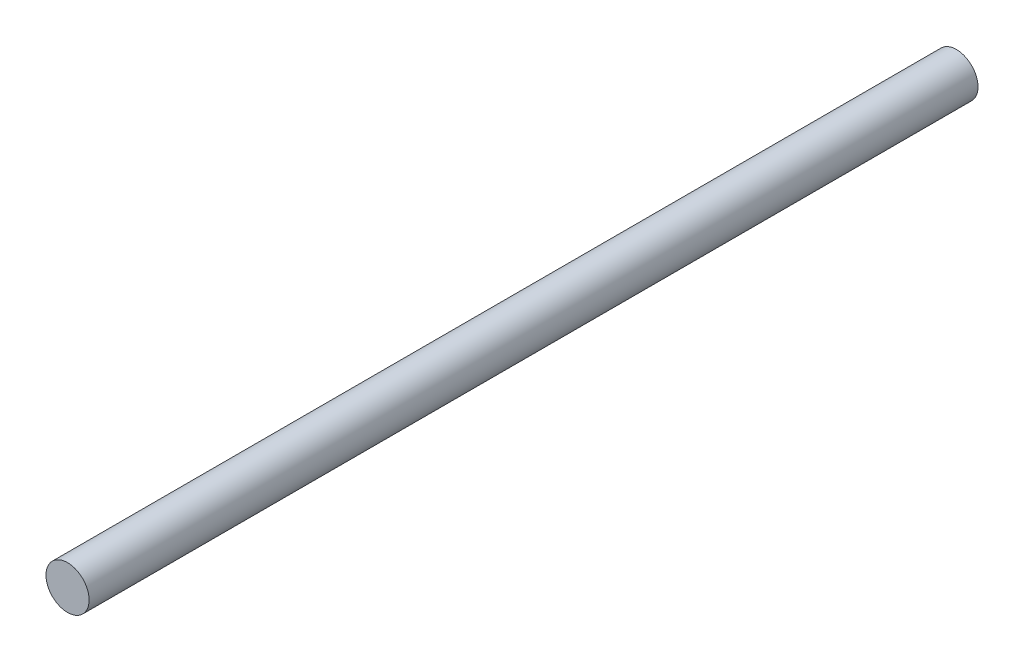
ISO-10303-21;
HEADER;
FILE_DESCRIPTION(('STEP AP214'),'2;1');
FILE_NAME('part.step','',(''),(''),'','','');
FILE_SCHEMA(('AUTOMOTIVE_DESIGN { 1 0 10303 214 1 1 1 1 }'));
ENDSEC;
DATA;
#1=APPLICATION_CONTEXT('core data for automotive mechanical design processes');
#2=APPLICATION_PROTOCOL_DEFINITION('international standard','automotive_design',2000,#1);
#3=PRODUCT_CONTEXT('',#1,'mechanical');
#4=PRODUCT('Part','Part','',(#3));
#5=PRODUCT_RELATED_PRODUCT_CATEGORY('part','',(#4));
#6=PRODUCT_DEFINITION_FORMATION('','',#4);
#7=PRODUCT_DEFINITION_CONTEXT('part definition',#1,'design');
#8=PRODUCT_DEFINITION('design','',#6,#7);
#9=PRODUCT_DEFINITION_SHAPE('','',#8);
#10=(LENGTH_UNIT() NAMED_UNIT(*) SI_UNIT(.MILLI.,.METRE.));
#11=(NAMED_UNIT(*) PLANE_ANGLE_UNIT() SI_UNIT($,.RADIAN.));
#12=(NAMED_UNIT(*) SI_UNIT($,.STERADIAN.) SOLID_ANGLE_UNIT());
#13=UNCERTAINTY_MEASURE_WITH_UNIT(LENGTH_MEASURE(1.E-05),#10,'distance_accuracy_value','');
#14=(GEOMETRIC_REPRESENTATION_CONTEXT(3) GLOBAL_UNCERTAINTY_ASSIGNED_CONTEXT((#13)) GLOBAL_UNIT_ASSIGNED_CONTEXT((#10,
#11,#12)) REPRESENTATION_CONTEXT('',''));
#15=CARTESIAN_POINT('',(0.,0.,0.));
#16=DIRECTION('',(0.,0.,1.));
#17=DIRECTION('',(1.,0.,0.));
#18=AXIS2_PLACEMENT_3D('',#15,#16,#17);
#19=CARTESIAN_POINT('',(0.,0.,61.77));
#20=DIRECTION('',(0.,0.,-1.));
#21=DIRECTION('',(-1.,0.,0.));
#22=AXIS2_PLACEMENT_3D('',#19,#20,#21);
#23=CYLINDRICAL_SURFACE('',#22,1.5);
#24=CARTESIAN_POINT('',(0.,0.,61.77));
#25=DIRECTION('',(0.,0.,1.));
#26=DIRECTION('',(1.,0.,0.));
#27=AXIS2_PLACEMENT_3D('',#24,#25,#26);
#28=CIRCLE('',#27,1.5);
#29=CARTESIAN_POINT('',(1.5,0.,61.77));
#30=VERTEX_POINT('',#29);
#31=EDGE_CURVE('E10',#30,#30,#28,.T.);
#32=ORIENTED_EDGE('',*,*,#31,.F.);
#33=EDGE_LOOP('',(#32));
#34=FACE_BOUND('',#33,.T.);
#35=CARTESIAN_POINT('',(0.,0.,0.));
#36=DIRECTION('',(0.,0.,1.));
#37=DIRECTION('',(1.,0.,0.));
#38=AXIS2_PLACEMENT_3D('',#35,#36,#37);
#39=CIRCLE('',#38,1.5);
#40=CARTESIAN_POINT('',(1.5,0.,0.));
#41=VERTEX_POINT('',#40);
#42=EDGE_CURVE('E33',#41,#41,#39,.T.);
#43=ORIENTED_EDGE('',*,*,#42,.T.);
#44=EDGE_LOOP('',(#43));
#45=FACE_BOUND('',#44,.T.);
#46=ADVANCED_FACE('F30',(#34,#45),#23,.T.);
#47=CARTESIAN_POINT('',(0.,0.,61.77));
#48=DIRECTION('',(0.,0.,1.));
#49=DIRECTION('',(1.,0.,0.));
#50=AXIS2_PLACEMENT_3D('',#47,#48,#49);
#51=PLANE('',#50);
#52=ORIENTED_EDGE('',*,*,#31,.T.);
#53=EDGE_LOOP('',(#52));
#54=FACE_BOUND('',#53,.T.);
#55=ADVANCED_FACE('F45',(#54),#51,.T.);
#56=CARTESIAN_POINT('',(0.,0.,0.));
#57=DIRECTION('',(0.,0.,1.));
#58=DIRECTION('',(1.,0.,0.));
#59=AXIS2_PLACEMENT_3D('',#56,#57,#58);
#60=PLANE('',#59);
#61=ORIENTED_EDGE('',*,*,#42,.F.);
#62=EDGE_LOOP('',(#61));
#63=FACE_BOUND('',#62,.T.);
#64=ADVANCED_FACE('F43',(#63),#60,.F.);
#65=CLOSED_SHELL('',(#46,#55,#64));
#66=MANIFOLD_SOLID_BREP('B2',#65);
#67=ADVANCED_BREP_SHAPE_REPRESENTATION('',(#18,#66),#14);
#68=SHAPE_DEFINITION_REPRESENTATION(#9,#67);
ENDSEC;
END-ISO-10303-21;
